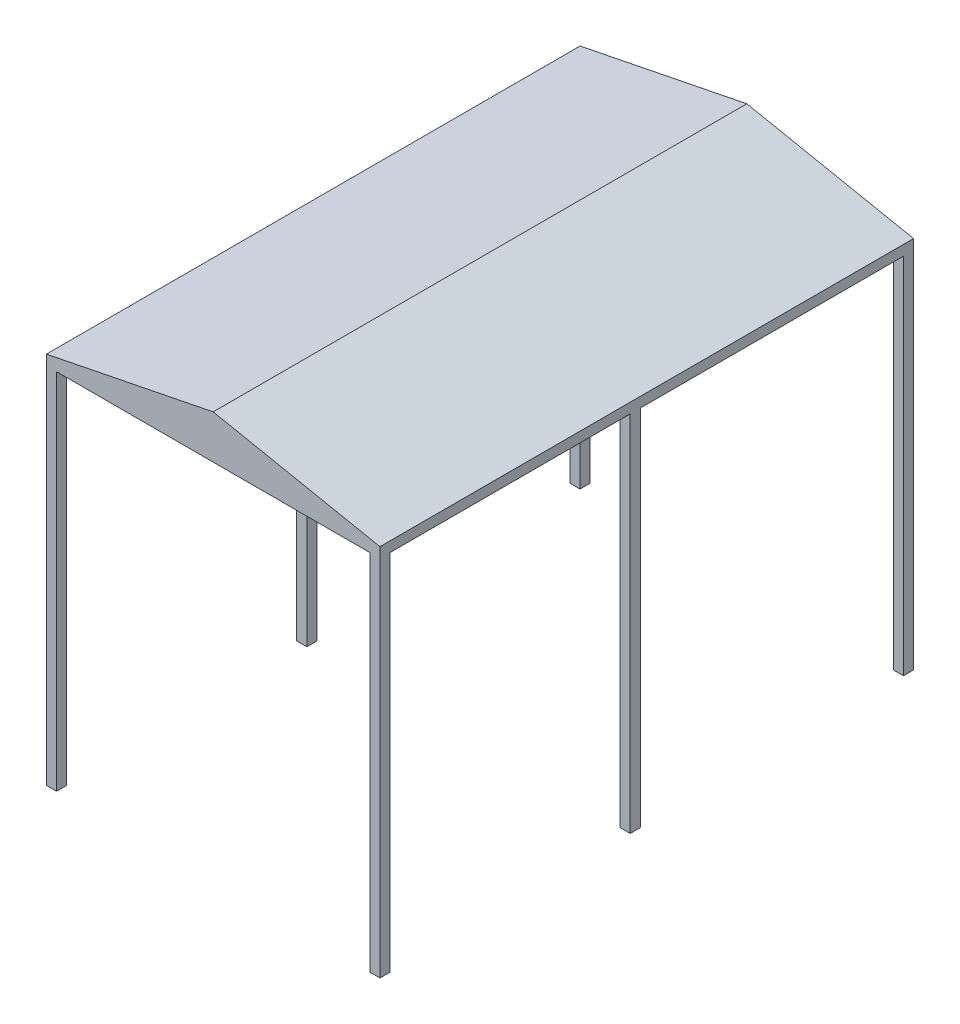
ISO-10303-21;
HEADER;
FILE_DESCRIPTION(('STEP AP214'),'2;1');
FILE_NAME('part.step','',(''),(''),'','','');
FILE_SCHEMA(('AUTOMOTIVE_DESIGN { 1 0 10303 214 1 1 1 1 }'));
ENDSEC;
DATA;
#1=APPLICATION_CONTEXT('core data for automotive mechanical design processes');
#2=APPLICATION_PROTOCOL_DEFINITION('international standard','automotive_design',2000,#1);
#3=PRODUCT_CONTEXT('',#1,'mechanical');
#4=PRODUCT('Part','Part','',(#3));
#5=PRODUCT_RELATED_PRODUCT_CATEGORY('part','',(#4));
#6=PRODUCT_DEFINITION_FORMATION('','',#4);
#7=PRODUCT_DEFINITION_CONTEXT('part definition',#1,'design');
#8=PRODUCT_DEFINITION('design','',#6,#7);
#9=PRODUCT_DEFINITION_SHAPE('','',#8);
#10=(LENGTH_UNIT() NAMED_UNIT(*) SI_UNIT(.MILLI.,.METRE.));
#11=(NAMED_UNIT(*) PLANE_ANGLE_UNIT() SI_UNIT($,.RADIAN.));
#12=(NAMED_UNIT(*) SI_UNIT($,.STERADIAN.) SOLID_ANGLE_UNIT());
#13=UNCERTAINTY_MEASURE_WITH_UNIT(LENGTH_MEASURE(1.E-05),#10,'distance_accuracy_value','');
#14=(GEOMETRIC_REPRESENTATION_CONTEXT(3) GLOBAL_UNCERTAINTY_ASSIGNED_CONTEXT((#13)) GLOBAL_UNIT_ASSIGNED_CONTEXT((#10,
#11,#12)) REPRESENTATION_CONTEXT('',''));
#15=CARTESIAN_POINT('',(0.,0.,0.));
#16=DIRECTION('',(0.,0.,1.));
#17=DIRECTION('',(1.,0.,0.));
#18=AXIS2_PLACEMENT_3D('',#15,#16,#17);
#19=CARTESIAN_POINT('',(0.,0.,4000.));
#20=DIRECTION('',(0.,1.,0.));
#21=DIRECTION('',(0.,0.,1.));
#22=AXIS2_PLACEMENT_3D('',#19,#20,#21);
#23=PLANE('',#22);
#24=DIRECTION('',(0.,0.,-1.));
#25=VECTOR('',#24,1.);
#26=CARTESIAN_POINT('',(0.,0.,4000.));
#27=LINE('',#26,#25);
#28=CARTESIAN_POINT('',(0.,0.,2123.8));
#29=VERTEX_POINT('',#28);
#30=CARTESIAN_POINT('',(0.,0.,2047.6));
#31=VERTEX_POINT('',#30);
#32=EDGE_CURVE('E41',#29,#31,#27,.T.);
#33=ORIENTED_EDGE('',*,*,#32,.T.);
#34=DIRECTION('',(-1.,0.,0.));
#35=VECTOR('',#34,1.);
#36=CARTESIAN_POINT('',(2500.,0.,2047.6));
#37=LINE('',#36,#35);
#38=CARTESIAN_POINT('',(76.2,0.,2047.6));
#39=VERTEX_POINT('',#38);
#40=EDGE_CURVE('E275',#39,#31,#37,.T.);
#41=ORIENTED_EDGE('',*,*,#40,.F.);
#42=DIRECTION('',(0.,0.,-1.));
#43=VECTOR('',#42,1.);
#44=CARTESIAN_POINT('',(76.2,0.,2123.8));
#45=LINE('',#44,#43);
#46=CARTESIAN_POINT('',(76.2,0.,2123.8));
#47=VERTEX_POINT('',#46);
#48=EDGE_CURVE('E334',#47,#39,#45,.T.);
#49=ORIENTED_EDGE('',*,*,#48,.F.);
#50=DIRECTION('',(1.,0.,0.));
#51=VECTOR('',#50,1.);
#52=CARTESIAN_POINT('',(0.,0.,2123.8));
#53=LINE('',#52,#51);
#54=EDGE_CURVE('E331',#29,#47,#53,.T.);
#55=ORIENTED_EDGE('',*,*,#54,.F.);
#56=EDGE_LOOP('',(#33,#41,#49,#55));
#57=FACE_BOUND('',#56,.T.);
#58=ADVANCED_FACE('F33',(#57),#23,.F.);
#59=DIRECTION('',(0.,0.,1.));
#60=VECTOR('',#59,1.);
#61=CARTESIAN_POINT('',(2423.8,0.,2047.6));
#62=LINE('',#61,#60);
#63=CARTESIAN_POINT('',(2423.8,0.,2047.6));
#64=VERTEX_POINT('',#63);
#65=CARTESIAN_POINT('',(2423.8,0.,2123.8));
#66=VERTEX_POINT('',#65);
#67=EDGE_CURVE('E337',#64,#66,#62,.T.);
#68=ORIENTED_EDGE('',*,*,#67,.F.);
#69=CARTESIAN_POINT('',(2500.,0.,2047.6));
#70=VERTEX_POINT('',#69);
#71=EDGE_CURVE('E245',#70,#64,#37,.T.);
#72=ORIENTED_EDGE('',*,*,#71,.F.);
#73=DIRECTION('',(0.,0.,-1.));
#74=VECTOR('',#73,1.);
#75=CARTESIAN_POINT('',(2500.,0.,4000.));
#76=LINE('',#75,#74);
#77=CARTESIAN_POINT('',(2500.,0.,2123.8));
#78=VERTEX_POINT('',#77);
#79=EDGE_CURVE('E389',#78,#70,#76,.T.);
#80=ORIENTED_EDGE('',*,*,#79,.F.);
#81=DIRECTION('',(1.,0.,0.));
#82=VECTOR('',#81,1.);
#83=CARTESIAN_POINT('',(2500.,0.,2123.8));
#84=LINE('',#83,#82);
#85=EDGE_CURVE('E340',#66,#78,#84,.T.);
#86=ORIENTED_EDGE('',*,*,#85,.F.);
#87=EDGE_LOOP('',(#68,#72,#80,#86));
#88=FACE_BOUND('',#87,.T.);
#89=ADVANCED_FACE('F462',(#88),#23,.F.);
#90=CARTESIAN_POINT('',(2500.,0.,76.2));
#91=VERTEX_POINT('',#90);
#92=CARTESIAN_POINT('',(2500.,0.,0.));
#93=VERTEX_POINT('',#92);
#94=EDGE_CURVE('E386',#91,#93,#76,.T.);
#95=ORIENTED_EDGE('',*,*,#94,.F.);
#96=DIRECTION('',(1.,0.,0.));
#97=VECTOR('',#96,1.);
#98=CARTESIAN_POINT('',(2423.8,0.,76.2));
#99=LINE('',#98,#97);
#100=CARTESIAN_POINT('',(2423.8,0.,76.2));
#101=VERTEX_POINT('',#100);
#102=EDGE_CURVE('E273',#101,#91,#99,.T.);
#103=ORIENTED_EDGE('',*,*,#102,.F.);
#104=DIRECTION('',(0.,0.,1.));
#105=VECTOR('',#104,1.);
#106=CARTESIAN_POINT('',(2423.8,0.,0.));
#107=LINE('',#106,#105);
#108=CARTESIAN_POINT('',(2423.8,0.,0.));
#109=VERTEX_POINT('',#108);
#110=EDGE_CURVE('E270',#109,#101,#107,.T.);
#111=ORIENTED_EDGE('',*,*,#110,.F.);
#112=DIRECTION('',(1.,0.,0.));
#113=VECTOR('',#112,1.);
#114=CARTESIAN_POINT('',(0.,0.,0.));
#115=LINE('',#114,#113);
#116=EDGE_CURVE('E380',#109,#93,#115,.T.);
#117=ORIENTED_EDGE('',*,*,#116,.T.);
#118=EDGE_LOOP('',(#95,#103,#111,#117));
#119=FACE_BOUND('',#118,.T.);
#120=ADVANCED_FACE('F403',(#119),#23,.F.);
#121=DIRECTION('',(1.,0.,0.));
#122=VECTOR('',#121,1.);
#123=CARTESIAN_POINT('',(0.,0.,4000.));
#124=LINE('',#123,#122);
#125=CARTESIAN_POINT('',(2423.8,0.,4000.));
#126=VERTEX_POINT('',#125);
#127=CARTESIAN_POINT('',(2500.,0.,4000.));
#128=VERTEX_POINT('',#127);
#129=EDGE_CURVE('E374',#126,#128,#124,.T.);
#130=ORIENTED_EDGE('',*,*,#129,.F.);
#131=DIRECTION('',(0.,0.,1.));
#132=VECTOR('',#131,1.);
#133=CARTESIAN_POINT('',(2423.8,0.,4000.));
#134=LINE('',#133,#132);
#135=CARTESIAN_POINT('',(2423.8,0.,3923.8));
#136=VERTEX_POINT('',#135);
#137=EDGE_CURVE('E299',#136,#126,#134,.T.);
#138=ORIENTED_EDGE('',*,*,#137,.F.);
#139=DIRECTION('',(-1.,0.,0.));
#140=VECTOR('',#139,1.);
#141=CARTESIAN_POINT('',(2423.8,0.,3923.8));
#142=LINE('',#141,#140);
#143=CARTESIAN_POINT('',(2500.,0.,3923.8));
#144=VERTEX_POINT('',#143);
#145=EDGE_CURVE('E342',#144,#136,#142,.T.);
#146=ORIENTED_EDGE('',*,*,#145,.F.);
#147=EDGE_CURVE('E387',#128,#144,#76,.T.);
#148=ORIENTED_EDGE('',*,*,#147,.F.);
#149=EDGE_LOOP('',(#130,#138,#146,#148));
#150=FACE_BOUND('',#149,.T.);
#151=ADVANCED_FACE('F450',(#150),#23,.F.);
#152=CARTESIAN_POINT('',(0.,0.,0.));
#153=VERTEX_POINT('',#152);
#154=CARTESIAN_POINT('',(76.2,0.,0.));
#155=VERTEX_POINT('',#154);
#156=EDGE_CURVE('E381',#153,#155,#115,.T.);
#157=ORIENTED_EDGE('',*,*,#156,.T.);
#158=DIRECTION('',(0.,0.,-1.));
#159=VECTOR('',#158,1.);
#160=CARTESIAN_POINT('',(76.2,0.,76.2));
#161=LINE('',#160,#159);
#162=CARTESIAN_POINT('',(76.2,0.,76.2));
#163=VERTEX_POINT('',#162);
#164=EDGE_CURVE('E268',#163,#155,#161,.T.);
#165=ORIENTED_EDGE('',*,*,#164,.F.);
#166=DIRECTION('',(1.,0.,0.));
#167=VECTOR('',#166,1.);
#168=CARTESIAN_POINT('',(0.,0.,76.2));
#169=LINE('',#168,#167);
#170=CARTESIAN_POINT('',(0.,0.,76.2));
#171=VERTEX_POINT('',#170);
#172=EDGE_CURVE('E240',#171,#163,#169,.T.);
#173=ORIENTED_EDGE('',*,*,#172,.F.);
#174=EDGE_CURVE('E42',#171,#153,#27,.T.);
#175=ORIENTED_EDGE('',*,*,#174,.T.);
#176=EDGE_LOOP('',(#157,#165,#173,#175));
#177=FACE_BOUND('',#176,.T.);
#178=ADVANCED_FACE('F414',(#177),#23,.F.);
#179=CARTESIAN_POINT('',(0.,0.,4000.));
#180=DIRECTION('',(1.,0.,0.));
#181=DIRECTION('',(0.,0.,-1.));
#182=AXIS2_PLACEMENT_3D('',#179,#180,#181);
#183=PLANE('',#182);
#184=DIRECTION('',(0.,0.,-1.));
#185=VECTOR('',#184,1.);
#186=CARTESIAN_POINT('',(0.,2723.8,2047.6));
#187=LINE('',#186,#185);
#188=CARTESIAN_POINT('',(0.,2723.8,2047.6));
#189=VERTEX_POINT('',#188);
#190=CARTESIAN_POINT('',(0.,2723.8,76.2));
#191=VERTEX_POINT('',#190);
#192=EDGE_CURVE('E241',#189,#191,#187,.T.);
#193=ORIENTED_EDGE('',*,*,#192,.F.);
#194=DIRECTION('',(0.,-1.,0.));
#195=VECTOR('',#194,1.);
#196=CARTESIAN_POINT('',(0.,2723.8,2047.6));
#197=LINE('',#196,#195);
#198=EDGE_CURVE('E277',#189,#31,#197,.T.);
#199=ORIENTED_EDGE('',*,*,#198,.T.);
#200=ORIENTED_EDGE('',*,*,#32,.F.);
#201=DIRECTION('',(0.,-1.,0.));
#202=VECTOR('',#201,1.);
#203=CARTESIAN_POINT('',(0.,2723.8,2123.8));
#204=LINE('',#203,#202);
#205=CARTESIAN_POINT('',(0.,2723.8,2123.8));
#206=VERTEX_POINT('',#205);
#207=EDGE_CURVE('E365',#206,#29,#204,.T.);
#208=ORIENTED_EDGE('',*,*,#207,.F.);
#209=DIRECTION('',(0.,0.,-1.));
#210=VECTOR('',#209,1.);
#211=CARTESIAN_POINT('',(0.,2723.8,3923.8));
#212=LINE('',#211,#210);
#213=CARTESIAN_POINT('',(0.,2723.8,3923.8));
#214=VERTEX_POINT('',#213);
#215=EDGE_CURVE('E305',#214,#206,#212,.T.);
#216=ORIENTED_EDGE('',*,*,#215,.F.);
#217=DIRECTION('',(0.,-1.,0.));
#218=VECTOR('',#217,1.);
#219=CARTESIAN_POINT('',(0.,2723.8,3923.8));
#220=LINE('',#219,#218);
#221=CARTESIAN_POINT('',(0.,0.,3923.8));
#222=VERTEX_POINT('',#221);
#223=EDGE_CURVE('E367',#214,#222,#220,.T.);
#224=ORIENTED_EDGE('',*,*,#223,.T.);
#225=CARTESIAN_POINT('',(0.,0.,4000.));
#226=VERTEX_POINT('',#225);
#227=EDGE_CURVE('E11',#226,#222,#27,.T.);
#228=ORIENTED_EDGE('',*,*,#227,.F.);
#229=DIRECTION('',(0.,-1.,0.));
#230=VECTOR('',#229,1.);
#231=CARTESIAN_POINT('',(0.,0.,4000.));
#232=LINE('',#231,#230);
#233=CARTESIAN_POINT('',(0.,2800.,4000.));
#234=VERTEX_POINT('',#233);
#235=EDGE_CURVE('E58',#234,#226,#232,.T.);
#236=ORIENTED_EDGE('',*,*,#235,.F.);
#237=DIRECTION('',(0.,0.,-1.));
#238=VECTOR('',#237,1.);
#239=CARTESIAN_POINT('',(0.,2800.,4000.));
#240=LINE('',#239,#238);
#241=CARTESIAN_POINT('',(0.,2800.,0.));
#242=VERTEX_POINT('',#241);
#243=EDGE_CURVE('E75',#234,#242,#240,.T.);
#244=ORIENTED_EDGE('',*,*,#243,.T.);
#245=DIRECTION('',(0.,-1.,0.));
#246=VECTOR('',#245,1.);
#247=CARTESIAN_POINT('',(0.,0.,0.));
#248=LINE('',#247,#246);
#249=EDGE_CURVE('E230',#242,#153,#248,.T.);
#250=ORIENTED_EDGE('',*,*,#249,.T.);
#251=ORIENTED_EDGE('',*,*,#174,.F.);
#252=DIRECTION('',(0.,-1.,0.));
#253=VECTOR('',#252,1.);
#254=CARTESIAN_POINT('',(0.,2723.8,76.2));
#255=LINE('',#254,#253);
#256=EDGE_CURVE('E265',#191,#171,#255,.T.);
#257=ORIENTED_EDGE('',*,*,#256,.F.);
#258=EDGE_LOOP('',(#193,#199,#200,#208,#216,#224,#228,#236,#244,#250,#251,#257));
#259=FACE_BOUND('',#258,.T.);
#260=ADVANCED_FACE('F35',(#259),#183,.F.);
#261=ORIENTED_EDGE('',*,*,#227,.T.);
#262=DIRECTION('',(-1.,0.,0.));
#263=VECTOR('',#262,1.);
#264=CARTESIAN_POINT('',(76.2,0.,3923.8));
#265=LINE('',#264,#263);
#266=CARTESIAN_POINT('',(76.2,0.,3923.8));
#267=VERTEX_POINT('',#266);
#268=EDGE_CURVE('E329',#267,#222,#265,.T.);
#269=ORIENTED_EDGE('',*,*,#268,.F.);
#270=DIRECTION('',(0.,0.,-1.));
#271=VECTOR('',#270,1.);
#272=CARTESIAN_POINT('',(76.2,0.,4000.));
#273=LINE('',#272,#271);
#274=CARTESIAN_POINT('',(76.2,0.,4000.));
#275=VERTEX_POINT('',#274);
#276=EDGE_CURVE('E280',#275,#267,#273,.T.);
#277=ORIENTED_EDGE('',*,*,#276,.F.);
#278=EDGE_CURVE('E82',#226,#275,#124,.T.);
#279=ORIENTED_EDGE('',*,*,#278,.F.);
#280=EDGE_LOOP('',(#261,#269,#277,#279));
#281=FACE_BOUND('',#280,.T.);
#282=ADVANCED_FACE('F440',(#281),#23,.F.);
#283=CARTESIAN_POINT('',(2500.,0.,4000.));
#284=DIRECTION('',(-1.,0.,0.));
#285=DIRECTION('',(0.,0.,1.));
#286=AXIS2_PLACEMENT_3D('',#283,#284,#285);
#287=PLANE('',#286);
#288=ORIENTED_EDGE('',*,*,#79,.T.);
#289=DIRECTION('',(0.,-1.,0.));
#290=VECTOR('',#289,1.);
#291=CARTESIAN_POINT('',(2500.,2723.8,2047.6));
#292=LINE('',#291,#290);
#293=CARTESIAN_POINT('',(2500.,2723.8,2047.6));
#294=VERTEX_POINT('',#293);
#295=EDGE_CURVE('E281',#294,#70,#292,.T.);
#296=ORIENTED_EDGE('',*,*,#295,.F.);
#297=DIRECTION('',(0.,0.,1.));
#298=VECTOR('',#297,1.);
#299=CARTESIAN_POINT('',(2500.,2723.8,76.2));
#300=LINE('',#299,#298);
#301=CARTESIAN_POINT('',(2500.,2723.8,76.2));
#302=VERTEX_POINT('',#301);
#303=EDGE_CURVE('E260',#302,#294,#300,.T.);
#304=ORIENTED_EDGE('',*,*,#303,.F.);
#305=DIRECTION('',(0.,-1.,0.));
#306=VECTOR('',#305,1.);
#307=CARTESIAN_POINT('',(2500.,2723.8,76.2));
#308=LINE('',#307,#306);
#309=EDGE_CURVE('E283',#302,#91,#308,.T.);
#310=ORIENTED_EDGE('',*,*,#309,.T.);
#311=ORIENTED_EDGE('',*,*,#94,.T.);
#312=DIRECTION('',(0.,1.,0.));
#313=VECTOR('',#312,1.);
#314=CARTESIAN_POINT('',(2500.,0.,0.));
#315=LINE('',#314,#313);
#316=CARTESIAN_POINT('',(2500.,2800.,0.));
#317=VERTEX_POINT('',#316);
#318=EDGE_CURVE('E375',#93,#317,#315,.T.);
#319=ORIENTED_EDGE('',*,*,#318,.T.);
#320=DIRECTION('',(0.,0.,-1.));
#321=VECTOR('',#320,1.);
#322=CARTESIAN_POINT('',(2500.,2800.,4000.));
#323=LINE('',#322,#321);
#324=CARTESIAN_POINT('',(2500.,2800.,4000.));
#325=VERTEX_POINT('',#324);
#326=EDGE_CURVE('E235',#325,#317,#323,.T.);
#327=ORIENTED_EDGE('',*,*,#326,.F.);
#328=DIRECTION('',(0.,1.,0.));
#329=VECTOR('',#328,1.);
#330=CARTESIAN_POINT('',(2500.,0.,4000.));
#331=LINE('',#330,#329);
#332=EDGE_CURVE('E377',#128,#325,#331,.T.);
#333=ORIENTED_EDGE('',*,*,#332,.F.);
#334=ORIENTED_EDGE('',*,*,#147,.T.);
#335=DIRECTION('',(0.,-1.,0.));
#336=VECTOR('',#335,1.);
#337=CARTESIAN_POINT('',(2500.,2723.8,3923.8));
#338=LINE('',#337,#336);
#339=CARTESIAN_POINT('',(2500.,2723.8,3923.8));
#340=VERTEX_POINT('',#339);
#341=EDGE_CURVE('E351',#340,#144,#338,.T.);
#342=ORIENTED_EDGE('',*,*,#341,.F.);
#343=DIRECTION('',(0.,0.,1.));
#344=VECTOR('',#343,1.);
#345=CARTESIAN_POINT('',(2500.,2723.8,3923.8));
#346=LINE('',#345,#344);
#347=CARTESIAN_POINT('',(2500.,2723.8,2123.8));
#348=VERTEX_POINT('',#347);
#349=EDGE_CURVE('E320',#348,#340,#346,.T.);
#350=ORIENTED_EDGE('',*,*,#349,.F.);
#351=DIRECTION('',(0.,-1.,0.));
#352=VECTOR('',#351,1.);
#353=CARTESIAN_POINT('',(2500.,2723.8,2123.8));
#354=LINE('',#353,#352);
#355=EDGE_CURVE('E353',#348,#78,#354,.T.);
#356=ORIENTED_EDGE('',*,*,#355,.T.);
#357=EDGE_LOOP('',(#288,#296,#304,#310,#311,#319,#327,#333,#334,#342,#350,#356));
#358=FACE_BOUND('',#357,.T.);
#359=ADVANCED_FACE('F397',(#358),#287,.F.);
#360=CARTESIAN_POINT('',(0.,0.,4000.));
#361=DIRECTION('',(0.,0.,-1.));
#362=DIRECTION('',(-1.,0.,0.));
#363=AXIS2_PLACEMENT_3D('',#360,#361,#362);
#364=PLANE('',#363);
#365=DIRECTION('',(-1.,0.,0.));
#366=VECTOR('',#365,1.);
#367=CARTESIAN_POINT('',(76.2,2723.8,4000.));
#368=LINE('',#367,#366);
#369=CARTESIAN_POINT('',(2423.8,2723.8,4000.));
#370=VERTEX_POINT('',#369);
#371=CARTESIAN_POINT('',(76.2,2723.8,4000.));
#372=VERTEX_POINT('',#371);
#373=EDGE_CURVE('E296',#370,#372,#368,.T.);
#374=ORIENTED_EDGE('',*,*,#373,.F.);
#375=DIRECTION('',(0.,-1.,0.));
#376=VECTOR('',#375,1.);
#377=CARTESIAN_POINT('',(2423.8,2723.8,4000.));
#378=LINE('',#377,#376);
#379=EDGE_CURVE('E346',#370,#126,#378,.T.);
#380=ORIENTED_EDGE('',*,*,#379,.T.);
#381=ORIENTED_EDGE('',*,*,#129,.T.);
#382=ORIENTED_EDGE('',*,*,#332,.T.);
#383=DIRECTION('',(-0.98058067569092,0.196116135138184,0.));
#384=VECTOR('',#383,1.);
#385=CARTESIAN_POINT('',(2500.,2800.,4000.));
#386=LINE('',#385,#384);
#387=CARTESIAN_POINT('',(1250.,3050.,4000.));
#388=VERTEX_POINT('',#387);
#389=EDGE_CURVE('E221',#325,#388,#386,.T.);
#390=ORIENTED_EDGE('',*,*,#389,.T.);
#391=DIRECTION('',(-0.98058067569092,-0.196116135138184,0.));
#392=VECTOR('',#391,1.);
#393=CARTESIAN_POINT('',(1250.,3050.,4000.));
#394=LINE('',#393,#392);
#395=EDGE_CURVE('E217',#388,#234,#394,.T.);
#396=ORIENTED_EDGE('',*,*,#395,.T.);
#397=ORIENTED_EDGE('',*,*,#235,.T.);
#398=ORIENTED_EDGE('',*,*,#278,.T.);
#399=DIRECTION('',(0.,-1.,0.));
#400=VECTOR('',#399,1.);
#401=CARTESIAN_POINT('',(76.2,2723.8,4000.));
#402=LINE('',#401,#400);
#403=EDGE_CURVE('E326',#372,#275,#402,.T.);
#404=ORIENTED_EDGE('',*,*,#403,.F.);
#405=EDGE_LOOP('',(#374,#380,#381,#382,#390,#396,#397,#398,#404));
#406=FACE_BOUND('',#405,.T.);
#407=ADVANCED_FACE('F445',(#406),#364,.F.);
#408=CARTESIAN_POINT('',(0.,0.,0.));
#409=DIRECTION('',(0.,0.,-1.));
#410=DIRECTION('',(-1.,0.,0.));
#411=AXIS2_PLACEMENT_3D('',#408,#409,#410);
#412=PLANE('',#411);
#413=DIRECTION('',(0.,-1.,0.));
#414=VECTOR('',#413,1.);
#415=CARTESIAN_POINT('',(2423.8,2723.8,0.));
#416=LINE('',#415,#414);
#417=CARTESIAN_POINT('',(2423.8,2723.8,0.));
#418=VERTEX_POINT('',#417);
#419=EDGE_CURVE('E288',#418,#109,#416,.T.);
#420=ORIENTED_EDGE('',*,*,#419,.F.);
#421=DIRECTION('',(1.,0.,0.));
#422=VECTOR('',#421,1.);
#423=CARTESIAN_POINT('',(76.2,2723.8,0.));
#424=LINE('',#423,#422);
#425=CARTESIAN_POINT('',(76.2,2723.8,0.));
#426=VERTEX_POINT('',#425);
#427=EDGE_CURVE('E251',#426,#418,#424,.T.);
#428=ORIENTED_EDGE('',*,*,#427,.F.);
#429=DIRECTION('',(0.,-1.,0.));
#430=VECTOR('',#429,1.);
#431=CARTESIAN_POINT('',(76.2,2723.8,0.));
#432=LINE('',#431,#430);
#433=EDGE_CURVE('E290',#426,#155,#432,.T.);
#434=ORIENTED_EDGE('',*,*,#433,.T.);
#435=ORIENTED_EDGE('',*,*,#156,.F.);
#436=ORIENTED_EDGE('',*,*,#249,.F.);
#437=DIRECTION('',(0.98058067569092,0.196116135138184,0.));
#438=VECTOR('',#437,1.);
#439=CARTESIAN_POINT('',(1250.,3050.,0.));
#440=LINE('',#439,#438);
#441=CARTESIAN_POINT('',(1250.,3050.,0.));
#442=VERTEX_POINT('',#441);
#443=EDGE_CURVE('E216',#242,#442,#440,.T.);
#444=ORIENTED_EDGE('',*,*,#443,.T.);
#445=DIRECTION('',(0.98058067569092,-0.196116135138184,0.));
#446=VECTOR('',#445,1.);
#447=CARTESIAN_POINT('',(2500.,2800.,0.));
#448=LINE('',#447,#446);
#449=EDGE_CURVE('E222',#442,#317,#448,.T.);
#450=ORIENTED_EDGE('',*,*,#449,.T.);
#451=ORIENTED_EDGE('',*,*,#318,.F.);
#452=ORIENTED_EDGE('',*,*,#116,.F.);
#453=EDGE_LOOP('',(#420,#428,#434,#435,#436,#444,#450,#451,#452));
#454=FACE_BOUND('',#453,.T.);
#455=ADVANCED_FACE('F227',(#454),#412,.T.);
#456=CARTESIAN_POINT('',(2423.8,2723.8,4000.));
#457=DIRECTION('',(1.,0.,0.));
#458=DIRECTION('',(0.,0.,-1.));
#459=AXIS2_PLACEMENT_3D('',#456,#457,#458);
#460=PLANE('',#459);
#461=ORIENTED_EDGE('',*,*,#137,.T.);
#462=ORIENTED_EDGE('',*,*,#379,.F.);
#463=DIRECTION('',(0.,0.,1.));
#464=VECTOR('',#463,1.);
#465=CARTESIAN_POINT('',(2423.8,2723.8,4000.));
#466=LINE('',#465,#464);
#467=CARTESIAN_POINT('',(2423.8,2723.8,3923.8));
#468=VERTEX_POINT('',#467);
#469=EDGE_CURVE('E49',#468,#370,#466,.T.);
#470=ORIENTED_EDGE('',*,*,#469,.F.);
#471=DIRECTION('',(0.,-1.,0.));
#472=VECTOR('',#471,1.);
#473=CARTESIAN_POINT('',(2423.8,2723.8,3923.8));
#474=LINE('',#473,#472);
#475=EDGE_CURVE('E349',#468,#136,#474,.T.);
#476=ORIENTED_EDGE('',*,*,#475,.T.);
#477=EDGE_LOOP('',(#461,#462,#470,#476));
#478=FACE_BOUND('',#477,.T.);
#479=ADVANCED_FACE('F559',(#478),#460,.F.);
#480=CARTESIAN_POINT('',(2423.8,2723.8,3923.8));
#481=DIRECTION('',(0.,0.,1.));
#482=DIRECTION('',(1.,0.,0.));
#483=AXIS2_PLACEMENT_3D('',#480,#481,#482);
#484=PLANE('',#483);
#485=ORIENTED_EDGE('',*,*,#145,.T.);
#486=ORIENTED_EDGE('',*,*,#475,.F.);
#487=DIRECTION('',(-1.,0.,0.));
#488=VECTOR('',#487,1.);
#489=CARTESIAN_POINT('',(2423.8,2723.8,3923.8));
#490=LINE('',#489,#488);
#491=EDGE_CURVE('E323',#340,#468,#490,.T.);
#492=ORIENTED_EDGE('',*,*,#491,.F.);
#493=ORIENTED_EDGE('',*,*,#341,.T.);
#494=EDGE_LOOP('',(#485,#486,#492,#493));
#495=FACE_BOUND('',#494,.T.);
#496=ADVANCED_FACE('F452',(#495),#484,.F.);
#497=CARTESIAN_POINT('',(2500.,2723.8,2123.8));
#498=DIRECTION('',(0.,0.,-1.));
#499=DIRECTION('',(-1.,0.,0.));
#500=AXIS2_PLACEMENT_3D('',#497,#498,#499);
#501=PLANE('',#500);
#502=ORIENTED_EDGE('',*,*,#85,.T.);
#503=ORIENTED_EDGE('',*,*,#355,.F.);
#504=DIRECTION('',(1.,0.,0.));
#505=VECTOR('',#504,1.);
#506=CARTESIAN_POINT('',(2500.,2723.8,2123.8));
#507=LINE('',#506,#505);
#508=CARTESIAN_POINT('',(2423.8,2723.8,2123.8));
#509=VERTEX_POINT('',#508);
#510=EDGE_CURVE('E317',#509,#348,#507,.T.);
#511=ORIENTED_EDGE('',*,*,#510,.F.);
#512=DIRECTION('',(0.,-1.,0.));
#513=VECTOR('',#512,1.);
#514=CARTESIAN_POINT('',(2423.8,2723.8,2123.8));
#515=LINE('',#514,#513);
#516=EDGE_CURVE('E356',#509,#66,#515,.T.);
#517=ORIENTED_EDGE('',*,*,#516,.T.);
#518=EDGE_LOOP('',(#502,#503,#511,#517));
#519=FACE_BOUND('',#518,.T.);
#520=ADVANCED_FACE('F458',(#519),#501,.F.);
#521=CARTESIAN_POINT('',(2423.8,2723.8,2047.6));
#522=DIRECTION('',(1.,0.,0.));
#523=DIRECTION('',(0.,0.,-1.));
#524=AXIS2_PLACEMENT_3D('',#521,#522,#523);
#525=PLANE('',#524);
#526=ORIENTED_EDGE('',*,*,#67,.T.);
#527=ORIENTED_EDGE('',*,*,#516,.F.);
#528=DIRECTION('',(0.,0.,1.));
#529=VECTOR('',#528,1.);
#530=CARTESIAN_POINT('',(2423.8,2723.8,2047.6));
#531=LINE('',#530,#529);
#532=CARTESIAN_POINT('',(2423.8,2723.8,2047.6));
#533=VERTEX_POINT('',#532);
#534=EDGE_CURVE('E314',#533,#509,#531,.T.);
#535=ORIENTED_EDGE('',*,*,#534,.F.);
#536=DIRECTION('',(0.,-1.,0.));
#537=VECTOR('',#536,1.);
#538=CARTESIAN_POINT('',(2423.8,2723.8,2047.6));
#539=LINE('',#538,#537);
#540=EDGE_CURVE('E358',#533,#64,#539,.T.);
#541=ORIENTED_EDGE('',*,*,#540,.T.);
#542=EDGE_LOOP('',(#526,#527,#535,#541));
#543=FACE_BOUND('',#542,.T.);
#544=ADVANCED_FACE('F548',(#543),#525,.F.);
#545=CARTESIAN_POINT('',(76.2,2723.8,2123.8));
#546=DIRECTION('',(-1.,0.,0.));
#547=DIRECTION('',(0.,0.,1.));
#548=AXIS2_PLACEMENT_3D('',#545,#546,#547);
#549=PLANE('',#548);
#550=ORIENTED_EDGE('',*,*,#48,.T.);
#551=DIRECTION('',(0.,-1.,0.));
#552=VECTOR('',#551,1.);
#553=CARTESIAN_POINT('',(76.2,2723.8,2047.6));
#554=LINE('',#553,#552);
#555=CARTESIAN_POINT('',(76.2,2723.8,2047.6));
#556=VERTEX_POINT('',#555);
#557=EDGE_CURVE('E361',#556,#39,#554,.T.);
#558=ORIENTED_EDGE('',*,*,#557,.F.);
#559=DIRECTION('',(0.,0.,-1.));
#560=VECTOR('',#559,1.);
#561=CARTESIAN_POINT('',(76.2,2723.8,2123.8));
#562=LINE('',#561,#560);
#563=CARTESIAN_POINT('',(76.2,2723.8,2123.8));
#564=VERTEX_POINT('',#563);
#565=EDGE_CURVE('E311',#564,#556,#562,.T.);
#566=ORIENTED_EDGE('',*,*,#565,.F.);
#567=DIRECTION('',(0.,-1.,0.));
#568=VECTOR('',#567,1.);
#569=CARTESIAN_POINT('',(76.2,2723.8,2123.8));
#570=LINE('',#569,#568);
#571=EDGE_CURVE('E363',#564,#47,#570,.T.);
#572=ORIENTED_EDGE('',*,*,#571,.T.);
#573=EDGE_LOOP('',(#550,#558,#566,#572));
#574=FACE_BOUND('',#573,.T.);
#575=ADVANCED_FACE('F537',(#574),#549,.F.);
#576=CARTESIAN_POINT('',(0.,2723.8,2123.8));
#577=DIRECTION('',(0.,0.,-1.));
#578=DIRECTION('',(-1.,0.,0.));
#579=AXIS2_PLACEMENT_3D('',#576,#577,#578);
#580=PLANE('',#579);
#581=ORIENTED_EDGE('',*,*,#54,.T.);
#582=ORIENTED_EDGE('',*,*,#571,.F.);
#583=DIRECTION('',(1.,0.,0.));
#584=VECTOR('',#583,1.);
#585=CARTESIAN_POINT('',(0.,2723.8,2123.8));
#586=LINE('',#585,#584);
#587=EDGE_CURVE('E308',#206,#564,#586,.T.);
#588=ORIENTED_EDGE('',*,*,#587,.F.);
#589=ORIENTED_EDGE('',*,*,#207,.T.);
#590=EDGE_LOOP('',(#581,#582,#588,#589));
#591=FACE_BOUND('',#590,.T.);
#592=ADVANCED_FACE('F434',(#591),#580,.F.);
#593=CARTESIAN_POINT('',(76.2,2723.8,3923.8));
#594=DIRECTION('',(0.,0.,1.));
#595=DIRECTION('',(1.,0.,0.));
#596=AXIS2_PLACEMENT_3D('',#593,#594,#595);
#597=PLANE('',#596);
#598=ORIENTED_EDGE('',*,*,#268,.T.);
#599=ORIENTED_EDGE('',*,*,#223,.F.);
#600=DIRECTION('',(-1.,0.,0.));
#601=VECTOR('',#600,1.);
#602=CARTESIAN_POINT('',(76.2,2723.8,3923.8));
#603=LINE('',#602,#601);
#604=CARTESIAN_POINT('',(76.2,2723.8,3923.8));
#605=VERTEX_POINT('',#604);
#606=EDGE_CURVE('E302',#605,#214,#603,.T.);
#607=ORIENTED_EDGE('',*,*,#606,.F.);
#608=DIRECTION('',(0.,-1.,0.));
#609=VECTOR('',#608,1.);
#610=CARTESIAN_POINT('',(76.2,2723.8,3923.8));
#611=LINE('',#610,#609);
#612=EDGE_CURVE('E370',#605,#267,#611,.T.);
#613=ORIENTED_EDGE('',*,*,#612,.T.);
#614=EDGE_LOOP('',(#598,#599,#607,#613));
#615=FACE_BOUND('',#614,.T.);
#616=ADVANCED_FACE('F438',(#615),#597,.F.);
#617=CARTESIAN_POINT('',(76.2,2723.8,4000.));
#618=DIRECTION('',(-1.,0.,0.));
#619=DIRECTION('',(0.,0.,1.));
#620=AXIS2_PLACEMENT_3D('',#617,#618,#619);
#621=PLANE('',#620);
#622=ORIENTED_EDGE('',*,*,#276,.T.);
#623=ORIENTED_EDGE('',*,*,#612,.F.);
#624=DIRECTION('',(0.,0.,-1.));
#625=VECTOR('',#624,1.);
#626=CARTESIAN_POINT('',(76.2,2723.8,4000.));
#627=LINE('',#626,#625);
#628=EDGE_CURVE('E298',#372,#605,#627,.T.);
#629=ORIENTED_EDGE('',*,*,#628,.F.);
#630=ORIENTED_EDGE('',*,*,#403,.T.);
#631=EDGE_LOOP('',(#622,#623,#629,#630));
#632=FACE_BOUND('',#631,.T.);
#633=ADVANCED_FACE('F514',(#632),#621,.F.);
#634=CARTESIAN_POINT('',(0.,2723.8,0.));
#635=DIRECTION('',(0.,1.,0.));
#636=DIRECTION('',(0.,0.,1.));
#637=AXIS2_PLACEMENT_3D('',#634,#635,#636);
#638=PLANE('',#637);
#639=ORIENTED_EDGE('',*,*,#373,.T.);
#640=ORIENTED_EDGE('',*,*,#628,.T.);
#641=ORIENTED_EDGE('',*,*,#606,.T.);
#642=ORIENTED_EDGE('',*,*,#215,.T.);
#643=ORIENTED_EDGE('',*,*,#587,.T.);
#644=ORIENTED_EDGE('',*,*,#565,.T.);
#645=DIRECTION('',(-1.,0.,0.));
#646=VECTOR('',#645,1.);
#647=CARTESIAN_POINT('',(2500.,2723.8,2047.6));
#648=LINE('',#647,#646);
#649=EDGE_CURVE('E262',#556,#189,#648,.T.);
#650=ORIENTED_EDGE('',*,*,#649,.T.);
#651=ORIENTED_EDGE('',*,*,#192,.T.);
#652=DIRECTION('',(1.,0.,0.));
#653=VECTOR('',#652,1.);
#654=CARTESIAN_POINT('',(0.,2723.8,76.2));
#655=LINE('',#654,#653);
#656=CARTESIAN_POINT('',(76.2,2723.8,76.2));
#657=VERTEX_POINT('',#656);
#658=EDGE_CURVE('E244',#191,#657,#655,.T.);
#659=ORIENTED_EDGE('',*,*,#658,.T.);
#660=DIRECTION('',(0.,0.,-1.));
#661=VECTOR('',#660,1.);
#662=CARTESIAN_POINT('',(76.2,2723.8,76.2));
#663=LINE('',#662,#661);
#664=EDGE_CURVE('E248',#657,#426,#663,.T.);
#665=ORIENTED_EDGE('',*,*,#664,.T.);
#666=ORIENTED_EDGE('',*,*,#427,.T.);
#667=DIRECTION('',(0.,0.,1.));
#668=VECTOR('',#667,1.);
#669=CARTESIAN_POINT('',(2423.8,2723.8,0.));
#670=LINE('',#669,#668);
#671=CARTESIAN_POINT('',(2423.8,2723.8,76.2));
#672=VERTEX_POINT('',#671);
#673=EDGE_CURVE('E254',#418,#672,#670,.T.);
#674=ORIENTED_EDGE('',*,*,#673,.T.);
#675=DIRECTION('',(1.,0.,0.));
#676=VECTOR('',#675,1.);
#677=CARTESIAN_POINT('',(2423.8,2723.8,76.2));
#678=LINE('',#677,#676);
#679=EDGE_CURVE('E257',#672,#302,#678,.T.);
#680=ORIENTED_EDGE('',*,*,#679,.T.);
#681=ORIENTED_EDGE('',*,*,#303,.T.);
#682=EDGE_CURVE('E263',#294,#533,#648,.T.);
#683=ORIENTED_EDGE('',*,*,#682,.T.);
#684=ORIENTED_EDGE('',*,*,#534,.T.);
#685=ORIENTED_EDGE('',*,*,#510,.T.);
#686=ORIENTED_EDGE('',*,*,#349,.T.);
#687=ORIENTED_EDGE('',*,*,#491,.T.);
#688=ORIENTED_EDGE('',*,*,#469,.T.);
#689=EDGE_LOOP('',(#639,#640,#641,#642,#643,#644,#650,#651,#659,#665,#666,#674,#680,#681,#683,
#684,#685,#686,#687,#688));
#690=FACE_BOUND('',#689,.T.);
#691=ADVANCED_FACE('F408',(#690),#638,.F.);
#692=CARTESIAN_POINT('',(2500.,2723.8,2047.6));
#693=DIRECTION('',(0.,0.,1.));
#694=DIRECTION('',(1.,0.,0.));
#695=AXIS2_PLACEMENT_3D('',#692,#693,#694);
#696=PLANE('',#695);
#697=ORIENTED_EDGE('',*,*,#682,.F.);
#698=ORIENTED_EDGE('',*,*,#295,.T.);
#699=ORIENTED_EDGE('',*,*,#71,.T.);
#700=ORIENTED_EDGE('',*,*,#540,.F.);
#701=EDGE_LOOP('',(#697,#698,#699,#700));
#702=FACE_BOUND('',#701,.T.);
#703=ADVANCED_FACE('F467',(#702),#696,.F.);
#704=ORIENTED_EDGE('',*,*,#40,.T.);
#705=ORIENTED_EDGE('',*,*,#198,.F.);
#706=ORIENTED_EDGE('',*,*,#649,.F.);
#707=ORIENTED_EDGE('',*,*,#557,.T.);
#708=EDGE_LOOP('',(#704,#705,#706,#707));
#709=FACE_BOUND('',#708,.T.);
#710=ADVANCED_FACE('F425',(#709),#696,.F.);
#711=CARTESIAN_POINT('',(2423.8,2723.8,76.2));
#712=DIRECTION('',(0.,0.,-1.));
#713=DIRECTION('',(-1.,0.,0.));
#714=AXIS2_PLACEMENT_3D('',#711,#712,#713);
#715=PLANE('',#714);
#716=ORIENTED_EDGE('',*,*,#102,.T.);
#717=ORIENTED_EDGE('',*,*,#309,.F.);
#718=ORIENTED_EDGE('',*,*,#679,.F.);
#719=DIRECTION('',(0.,-1.,0.));
#720=VECTOR('',#719,1.);
#721=CARTESIAN_POINT('',(2423.8,2723.8,76.2));
#722=LINE('',#721,#720);
#723=EDGE_CURVE('E286',#672,#101,#722,.T.);
#724=ORIENTED_EDGE('',*,*,#723,.T.);
#725=EDGE_LOOP('',(#716,#717,#718,#724));
#726=FACE_BOUND('',#725,.T.);
#727=ADVANCED_FACE('F470',(#726),#715,.F.);
#728=CARTESIAN_POINT('',(2423.8,2723.8,0.));
#729=DIRECTION('',(1.,0.,0.));
#730=DIRECTION('',(0.,0.,-1.));
#731=AXIS2_PLACEMENT_3D('',#728,#729,#730);
#732=PLANE('',#731);
#733=ORIENTED_EDGE('',*,*,#110,.T.);
#734=ORIENTED_EDGE('',*,*,#723,.F.);
#735=ORIENTED_EDGE('',*,*,#673,.F.);
#736=ORIENTED_EDGE('',*,*,#419,.T.);
#737=EDGE_LOOP('',(#733,#734,#735,#736));
#738=FACE_BOUND('',#737,.T.);
#739=ADVANCED_FACE('F406',(#738),#732,.F.);
#740=CARTESIAN_POINT('',(76.2,2723.8,76.2));
#741=DIRECTION('',(-1.,0.,0.));
#742=DIRECTION('',(0.,0.,1.));
#743=AXIS2_PLACEMENT_3D('',#740,#741,#742);
#744=PLANE('',#743);
#745=ORIENTED_EDGE('',*,*,#164,.T.);
#746=ORIENTED_EDGE('',*,*,#433,.F.);
#747=ORIENTED_EDGE('',*,*,#664,.F.);
#748=DIRECTION('',(0.,-1.,0.));
#749=VECTOR('',#748,1.);
#750=CARTESIAN_POINT('',(76.2,2723.8,76.2));
#751=LINE('',#750,#749);
#752=EDGE_CURVE('E293',#657,#163,#751,.T.);
#753=ORIENTED_EDGE('',*,*,#752,.T.);
#754=EDGE_LOOP('',(#745,#746,#747,#753));
#755=FACE_BOUND('',#754,.T.);
#756=ADVANCED_FACE('F411',(#755),#744,.F.);
#757=CARTESIAN_POINT('',(0.,2723.8,76.2));
#758=DIRECTION('',(0.,0.,-1.));
#759=DIRECTION('',(-1.,0.,0.));
#760=AXIS2_PLACEMENT_3D('',#757,#758,#759);
#761=PLANE('',#760);
#762=ORIENTED_EDGE('',*,*,#172,.T.);
#763=ORIENTED_EDGE('',*,*,#752,.F.);
#764=ORIENTED_EDGE('',*,*,#658,.F.);
#765=ORIENTED_EDGE('',*,*,#256,.T.);
#766=EDGE_LOOP('',(#762,#763,#764,#765));
#767=FACE_BOUND('',#766,.T.);
#768=ADVANCED_FACE('F420',(#767),#761,.F.);
#769=CARTESIAN_POINT('',(2500.,2800.,6512.46890528022));
#770=DIRECTION('',(0.196116135138184,0.98058067569092,0.));
#771=DIRECTION('',(-0.98058067569092,0.196116135138184,0.));
#772=AXIS2_PLACEMENT_3D('',#769,#770,#771);
#773=PLANE('',#772);
#774=ORIENTED_EDGE('',*,*,#389,.F.);
#775=ORIENTED_EDGE('',*,*,#326,.T.);
#776=ORIENTED_EDGE('',*,*,#449,.F.);
#777=DIRECTION('',(0.,0.,-1.));
#778=VECTOR('',#777,1.);
#779=CARTESIAN_POINT('',(1250.,3050.,6512.46890528022));
#780=LINE('',#779,#778);
#781=EDGE_CURVE('E213',#388,#442,#780,.T.);
#782=ORIENTED_EDGE('',*,*,#781,.F.);
#783=EDGE_LOOP('',(#774,#775,#776,#782));
#784=FACE_BOUND('',#783,.T.);
#785=ADVANCED_FACE('F233',(#784),#773,.T.);
#786=CARTESIAN_POINT('',(1250.,3050.,6512.46890528022));
#787=DIRECTION('',(-0.196116135138184,0.98058067569092,0.));
#788=DIRECTION('',(-0.98058067569092,-0.196116135138184,0.));
#789=AXIS2_PLACEMENT_3D('',#786,#787,#788);
#790=PLANE('',#789);
#791=ORIENTED_EDGE('',*,*,#395,.F.);
#792=ORIENTED_EDGE('',*,*,#781,.T.);
#793=ORIENTED_EDGE('',*,*,#443,.F.);
#794=ORIENTED_EDGE('',*,*,#243,.F.);
#795=EDGE_LOOP('',(#791,#792,#793,#794));
#796=FACE_BOUND('',#795,.T.);
#797=ADVANCED_FACE('F215',(#796),#790,.T.);
#798=CLOSED_SHELL('',(#58,#89,#120,#151,#178,#260,#282,#359,#407,#455,#479,#496,#520,#544,#575,
#592,#616,#633,#691,#703,#710,#727,#739,#756,#768,#785,#797));
#799=MANIFOLD_SOLID_BREP('B2',#798);
#800=ADVANCED_BREP_SHAPE_REPRESENTATION('',(#18,#799),#14);
#801=SHAPE_DEFINITION_REPRESENTATION(#9,#800);
ENDSEC;
END-ISO-10303-21;
